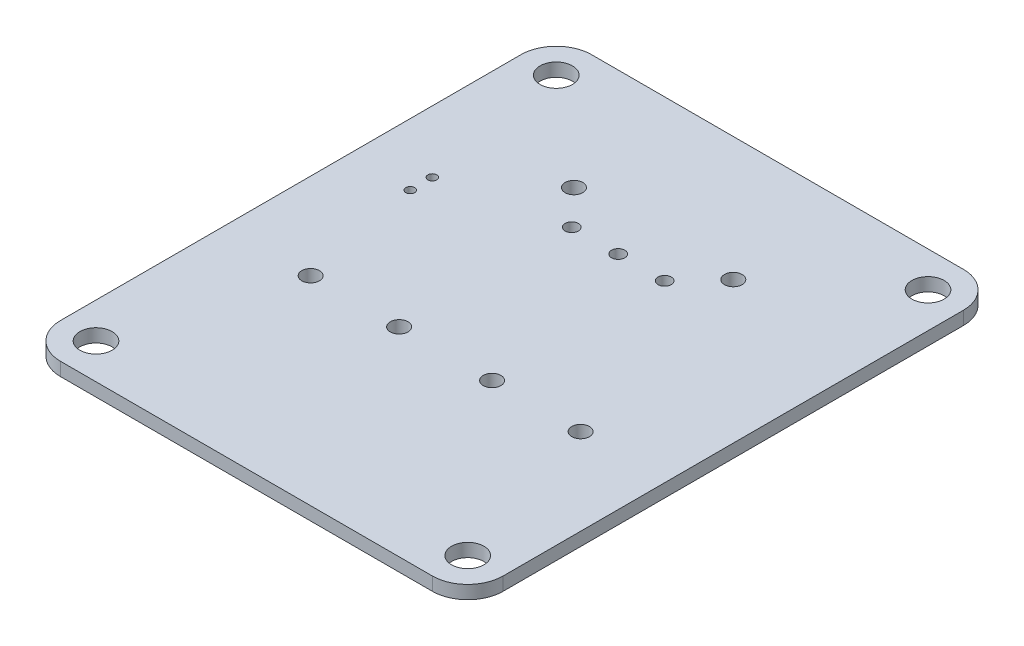
ISO-10303-21;
HEADER;
FILE_DESCRIPTION(('STEP AP214'),'2;1');
FILE_NAME('part.step','',(''),(''),'','','');
FILE_SCHEMA(('AUTOMOTIVE_DESIGN { 1 0 10303 214 1 1 1 1 }'));
ENDSEC;
DATA;
#1=APPLICATION_CONTEXT('core data for automotive mechanical design processes');
#2=APPLICATION_PROTOCOL_DEFINITION('international standard','automotive_design',2000,#1);
#3=PRODUCT_CONTEXT('',#1,'mechanical');
#4=PRODUCT('Part','Part','',(#3));
#5=PRODUCT_RELATED_PRODUCT_CATEGORY('part','',(#4));
#6=PRODUCT_DEFINITION_FORMATION('','',#4);
#7=PRODUCT_DEFINITION_CONTEXT('part definition',#1,'design');
#8=PRODUCT_DEFINITION('design','',#6,#7);
#9=PRODUCT_DEFINITION_SHAPE('','',#8);
#10=(LENGTH_UNIT() NAMED_UNIT(*) SI_UNIT(.MILLI.,.METRE.));
#11=(NAMED_UNIT(*) PLANE_ANGLE_UNIT() SI_UNIT($,.RADIAN.));
#12=(NAMED_UNIT(*) SI_UNIT($,.STERADIAN.) SOLID_ANGLE_UNIT());
#13=UNCERTAINTY_MEASURE_WITH_UNIT(LENGTH_MEASURE(1.E-05),#10,'distance_accuracy_value','');
#14=(GEOMETRIC_REPRESENTATION_CONTEXT(3) GLOBAL_UNCERTAINTY_ASSIGNED_CONTEXT((#13)) GLOBAL_UNIT_ASSIGNED_CONTEXT((#10,
#11,#12)) REPRESENTATION_CONTEXT('',''));
#15=CARTESIAN_POINT('',(0.,0.,0.));
#16=DIRECTION('',(0.,0.,1.));
#17=DIRECTION('',(1.,0.,0.));
#18=AXIS2_PLACEMENT_3D('',#15,#16,#17);
#19=CARTESIAN_POINT('',(-21.,1.5,26.));
#20=DIRECTION('',(0.,1.,0.));
#21=DIRECTION('',(0.,0.,1.));
#22=AXIS2_PLACEMENT_3D('',#19,#20,#21);
#23=PLANE('',#22);
#24=CARTESIAN_POINT('',(-18.,1.5,-6.49999999999999));
#25=DIRECTION('',(0.,1.,0.));
#26=DIRECTION('',(0.,0.,1.));
#27=AXIS2_PLACEMENT_3D('',#24,#25,#26);
#28=CIRCLE('',#27,0.499999999999999);
#29=CARTESIAN_POINT('',(-18.,1.5,-5.99999999999999));
#30=VERTEX_POINT('',#29);
#31=EDGE_CURVE('E282',#30,#30,#28,.T.);
#32=ORIENTED_EDGE('',*,*,#31,.F.);
#33=EDGE_LOOP('',(#32));
#34=FACE_BOUND('',#33,.T.);
#35=CARTESIAN_POINT('',(-18.,1.5,-8.99999999999999));
#36=DIRECTION('',(0.,1.,0.));
#37=DIRECTION('',(0.,0.,1.));
#38=AXIS2_PLACEMENT_3D('',#35,#36,#37);
#39=CIRCLE('',#38,0.499999999999999);
#40=CARTESIAN_POINT('',(-18.,1.5,-8.49999999999999));
#41=VERTEX_POINT('',#40);
#42=EDGE_CURVE('E276',#41,#41,#39,.T.);
#43=ORIENTED_EDGE('',*,*,#42,.F.);
#44=EDGE_LOOP('',(#43));
#45=FACE_BOUND('',#44,.T.);
#46=CARTESIAN_POINT('',(15.25,1.5,7.5));
#47=DIRECTION('',(0.,1.,0.));
#48=DIRECTION('',(0.,0.,-1.));
#49=AXIS2_PLACEMENT_3D('',#46,#47,#48);
#50=CIRCLE('',#49,1.);
#51=CARTESIAN_POINT('',(15.25,1.5,6.49999999999999));
#52=VERTEX_POINT('',#51);
#53=EDGE_CURVE('E270',#52,#52,#50,.T.);
#54=ORIENTED_EDGE('',*,*,#53,.F.);
#55=EDGE_LOOP('',(#54));
#56=FACE_BOUND('',#55,.T.);
#57=CARTESIAN_POINT('',(5.25,1.5,7.5));
#58=DIRECTION('',(0.,1.,0.));
#59=DIRECTION('',(0.,0.,-1.));
#60=AXIS2_PLACEMENT_3D('',#57,#58,#59);
#61=CIRCLE('',#60,1.);
#62=CARTESIAN_POINT('',(5.25,1.5,6.5));
#63=VERTEX_POINT('',#62);
#64=EDGE_CURVE('E264',#63,#63,#61,.T.);
#65=ORIENTED_EDGE('',*,*,#64,.F.);
#66=EDGE_LOOP('',(#65));
#67=FACE_BOUND('',#66,.T.);
#68=CARTESIAN_POINT('',(-5.25,1.5,7.5));
#69=DIRECTION('',(0.,1.,0.));
#70=DIRECTION('',(0.,0.,1.));
#71=AXIS2_PLACEMENT_3D('',#68,#69,#70);
#72=CIRCLE('',#71,1.);
#73=CARTESIAN_POINT('',(-5.25,1.5,8.5));
#74=VERTEX_POINT('',#73);
#75=EDGE_CURVE('E258',#74,#74,#72,.T.);
#76=ORIENTED_EDGE('',*,*,#75,.F.);
#77=EDGE_LOOP('',(#76));
#78=FACE_BOUND('',#77,.T.);
#79=CARTESIAN_POINT('',(-15.25,1.5,7.5));
#80=DIRECTION('',(0.,1.,0.));
#81=DIRECTION('',(0.,0.,1.));
#82=AXIS2_PLACEMENT_3D('',#79,#80,#81);
#83=CIRCLE('',#82,1.);
#84=CARTESIAN_POINT('',(-15.25,1.5,8.5));
#85=VERTEX_POINT('',#84);
#86=EDGE_CURVE('E252',#85,#85,#83,.T.);
#87=ORIENTED_EDGE('',*,*,#86,.F.);
#88=EDGE_LOOP('',(#87));
#89=FACE_BOUND('',#88,.T.);
#90=CARTESIAN_POINT('',(5.25,1.5,-12.));
#91=DIRECTION('',(0.,1.,0.));
#92=DIRECTION('',(0.,0.,-1.));
#93=AXIS2_PLACEMENT_3D('',#90,#91,#92);
#94=CIRCLE('',#93,0.75);
#95=CARTESIAN_POINT('',(5.25,1.5,-12.75));
#96=VERTEX_POINT('',#95);
#97=EDGE_CURVE('E246',#96,#96,#94,.T.);
#98=ORIENTED_EDGE('',*,*,#97,.F.);
#99=EDGE_LOOP('',(#98));
#100=FACE_BOUND('',#99,.T.);
#101=CARTESIAN_POINT('',(0.,1.5,-12.));
#102=DIRECTION('',(0.,1.,0.));
#103=DIRECTION('',(0.,0.,1.));
#104=AXIS2_PLACEMENT_3D('',#101,#102,#103);
#105=CIRCLE('',#104,0.75);
#106=CARTESIAN_POINT('',(0.,1.5,-11.25));
#107=VERTEX_POINT('',#106);
#108=EDGE_CURVE('E240',#107,#107,#105,.T.);
#109=ORIENTED_EDGE('',*,*,#108,.F.);
#110=EDGE_LOOP('',(#109));
#111=FACE_BOUND('',#110,.T.);
#112=CARTESIAN_POINT('',(-5.25,1.5,-12.));
#113=DIRECTION('',(0.,1.,0.));
#114=DIRECTION('',(0.,0.,1.));
#115=AXIS2_PLACEMENT_3D('',#112,#113,#114);
#116=CIRCLE('',#115,0.75);
#117=CARTESIAN_POINT('',(-5.25,1.5,-11.25));
#118=VERTEX_POINT('',#117);
#119=EDGE_CURVE('E234',#118,#118,#116,.T.);
#120=ORIENTED_EDGE('',*,*,#119,.F.);
#121=EDGE_LOOP('',(#120));
#122=FACE_BOUND('',#121,.T.);
#123=CARTESIAN_POINT('',(9.,1.5,-16.));
#124=DIRECTION('',(0.,1.,0.));
#125=DIRECTION('',(0.,0.,-1.));
#126=AXIS2_PLACEMENT_3D('',#123,#124,#125);
#127=CIRCLE('',#126,1.);
#128=CARTESIAN_POINT('',(9.,1.5,-17.));
#129=VERTEX_POINT('',#128);
#130=EDGE_CURVE('E228',#129,#129,#127,.T.);
#131=ORIENTED_EDGE('',*,*,#130,.F.);
#132=EDGE_LOOP('',(#131));
#133=FACE_BOUND('',#132,.T.);
#134=CARTESIAN_POINT('',(-9.,1.5,-16.));
#135=DIRECTION('',(0.,1.,0.));
#136=DIRECTION('',(0.,0.,1.));
#137=AXIS2_PLACEMENT_3D('',#134,#135,#136);
#138=CIRCLE('',#137,1.);
#139=CARTESIAN_POINT('',(-9.,1.5,-15.));
#140=VERTEX_POINT('',#139);
#141=EDGE_CURVE('E222',#140,#140,#138,.T.);
#142=ORIENTED_EDGE('',*,*,#141,.F.);
#143=EDGE_LOOP('',(#142));
#144=FACE_BOUND('',#143,.T.);
#145=CARTESIAN_POINT('',(21.,1.5,26.));
#146=DIRECTION('',(0.,1.,0.));
#147=DIRECTION('',(0.,0.,1.));
#148=AXIS2_PLACEMENT_3D('',#145,#146,#147);
#149=CIRCLE('',#148,1.825);
#150=CARTESIAN_POINT('',(21.,1.5,27.825));
#151=VERTEX_POINT('',#150);
#152=EDGE_CURVE('E203',#151,#151,#149,.T.);
#153=ORIENTED_EDGE('',*,*,#152,.F.);
#154=EDGE_LOOP('',(#153));
#155=FACE_BOUND('',#154,.T.);
#156=CARTESIAN_POINT('',(-21.,1.5,-26.));
#157=DIRECTION('',(0.,1.,0.));
#158=DIRECTION('',(0.,0.,1.));
#159=AXIS2_PLACEMENT_3D('',#156,#157,#158);
#160=CIRCLE('',#159,1.825);
#161=CARTESIAN_POINT('',(-21.,1.5,-24.175));
#162=VERTEX_POINT('',#161);
#163=EDGE_CURVE('E142',#162,#162,#160,.T.);
#164=ORIENTED_EDGE('',*,*,#163,.F.);
#165=EDGE_LOOP('',(#164));
#166=FACE_BOUND('',#165,.T.);
#167=CARTESIAN_POINT('',(-21.,1.5,26.));
#168=DIRECTION('',(0.,1.,0.));
#169=DIRECTION('',(0.,0.,1.));
#170=AXIS2_PLACEMENT_3D('',#167,#168,#169);
#171=CIRCLE('',#170,4.);
#172=CARTESIAN_POINT('',(-25.,1.5,26.));
#173=VERTEX_POINT('',#172);
#174=CARTESIAN_POINT('',(-21.,1.5,30.));
#175=VERTEX_POINT('',#174);
#176=EDGE_CURVE('E156',#173,#175,#171,.T.);
#177=ORIENTED_EDGE('',*,*,#176,.T.);
#178=DIRECTION('',(1.,0.,0.));
#179=VECTOR('',#178,1.);
#180=CARTESIAN_POINT('',(-21.,1.5,30.));
#181=LINE('',#180,#179);
#182=CARTESIAN_POINT('',(21.,1.5,30.));
#183=VERTEX_POINT('',#182);
#184=EDGE_CURVE('E100',#175,#183,#181,.T.);
#185=ORIENTED_EDGE('',*,*,#184,.T.);
#186=CARTESIAN_POINT('',(21.,1.5,26.));
#187=DIRECTION('',(0.,1.,0.));
#188=DIRECTION('',(0.,0.,1.));
#189=AXIS2_PLACEMENT_3D('',#186,#187,#188);
#190=CIRCLE('',#189,4.);
#191=CARTESIAN_POINT('',(25.,1.5,26.));
#192=VERTEX_POINT('',#191);
#193=EDGE_CURVE('E172',#183,#192,#190,.T.);
#194=ORIENTED_EDGE('',*,*,#193,.T.);
#195=DIRECTION('',(0.,0.,-1.));
#196=VECTOR('',#195,1.);
#197=CARTESIAN_POINT('',(25.,1.5,-26.));
#198=LINE('',#197,#196);
#199=CARTESIAN_POINT('',(25.,1.5,-26.));
#200=VERTEX_POINT('',#199);
#201=EDGE_CURVE('E185',#192,#200,#198,.T.);
#202=ORIENTED_EDGE('',*,*,#201,.T.);
#203=CARTESIAN_POINT('',(21.,1.5,-26.));
#204=DIRECTION('',(0.,1.,0.));
#205=DIRECTION('',(0.,0.,-1.));
#206=AXIS2_PLACEMENT_3D('',#203,#204,#205);
#207=CIRCLE('',#206,4.);
#208=CARTESIAN_POINT('',(21.,1.5,-30.));
#209=VERTEX_POINT('',#208);
#210=EDGE_CURVE('E120',#200,#209,#207,.T.);
#211=ORIENTED_EDGE('',*,*,#210,.T.);
#212=DIRECTION('',(-1.,0.,0.));
#213=VECTOR('',#212,1.);
#214=CARTESIAN_POINT('',(-21.,1.5,-30.));
#215=LINE('',#214,#213);
#216=CARTESIAN_POINT('',(-21.,1.5,-30.));
#217=VERTEX_POINT('',#216);
#218=EDGE_CURVE('E114',#209,#217,#215,.T.);
#219=ORIENTED_EDGE('',*,*,#218,.T.);
#220=CARTESIAN_POINT('',(-21.,1.5,-26.));
#221=DIRECTION('',(0.,1.,0.));
#222=DIRECTION('',(0.,0.,1.));
#223=AXIS2_PLACEMENT_3D('',#220,#221,#222);
#224=CIRCLE('',#223,4.);
#225=CARTESIAN_POINT('',(-25.,1.5,-26.));
#226=VERTEX_POINT('',#225);
#227=EDGE_CURVE('E118',#217,#226,#224,.T.);
#228=ORIENTED_EDGE('',*,*,#227,.T.);
#229=DIRECTION('',(0.,0.,1.));
#230=VECTOR('',#229,1.);
#231=CARTESIAN_POINT('',(-25.,1.5,-26.));
#232=LINE('',#231,#230);
#233=EDGE_CURVE('E56',#226,#173,#232,.T.);
#234=ORIENTED_EDGE('',*,*,#233,.T.);
#235=EDGE_LOOP('',(#177,#185,#194,#202,#211,#219,#228,#234));
#236=FACE_BOUND('',#235,.T.);
#237=CARTESIAN_POINT('',(21.,1.5,-26.));
#238=DIRECTION('',(0.,1.,0.));
#239=DIRECTION('',(0.,0.,-1.));
#240=AXIS2_PLACEMENT_3D('',#237,#238,#239);
#241=CIRCLE('',#240,1.825);
#242=CARTESIAN_POINT('',(21.,1.5,-27.825));
#243=VERTEX_POINT('',#242);
#244=EDGE_CURVE('E197',#243,#243,#241,.T.);
#245=ORIENTED_EDGE('',*,*,#244,.F.);
#246=EDGE_LOOP('',(#245));
#247=FACE_BOUND('',#246,.T.);
#248=CARTESIAN_POINT('',(-21.,1.5,26.));
#249=DIRECTION('',(0.,1.,0.));
#250=DIRECTION('',(0.,0.,-1.));
#251=AXIS2_PLACEMENT_3D('',#248,#249,#250);
#252=CIRCLE('',#251,1.825);
#253=CARTESIAN_POINT('',(-21.,1.5,24.175));
#254=VERTEX_POINT('',#253);
#255=EDGE_CURVE('E210',#254,#254,#252,.T.);
#256=ORIENTED_EDGE('',*,*,#255,.F.);
#257=EDGE_LOOP('',(#256));
#258=FACE_BOUND('',#257,.T.);
#259=ADVANCED_FACE('F39',(#34,#45,#56,#67,#78,#89,#100,#111,#122,#133,#144,#155,#166,#236,#247,
#258),#23,.T.);
#260=CARTESIAN_POINT('',(-21.,0.,26.));
#261=DIRECTION('',(0.,1.,0.));
#262=DIRECTION('',(0.,0.,1.));
#263=AXIS2_PLACEMENT_3D('',#260,#261,#262);
#264=PLANE('',#263);
#265=CARTESIAN_POINT('',(-18.,0.,-6.49999999999999));
#266=DIRECTION('',(0.,1.,0.));
#267=DIRECTION('',(0.,0.,1.));
#268=AXIS2_PLACEMENT_3D('',#265,#266,#267);
#269=CIRCLE('',#268,0.499999999999999);
#270=CARTESIAN_POINT('',(-18.,0.,-5.99999999999999));
#271=VERTEX_POINT('',#270);
#272=EDGE_CURVE('E279',#271,#271,#269,.F.);
#273=ORIENTED_EDGE('',*,*,#272,.F.);
#274=EDGE_LOOP('',(#273));
#275=FACE_BOUND('',#274,.T.);
#276=CARTESIAN_POINT('',(-18.,0.,-8.99999999999999));
#277=DIRECTION('',(0.,1.,0.));
#278=DIRECTION('',(0.,0.,1.));
#279=AXIS2_PLACEMENT_3D('',#276,#277,#278);
#280=CIRCLE('',#279,0.499999999999999);
#281=CARTESIAN_POINT('',(-18.,0.,-8.49999999999999));
#282=VERTEX_POINT('',#281);
#283=EDGE_CURVE('E273',#282,#282,#280,.F.);
#284=ORIENTED_EDGE('',*,*,#283,.F.);
#285=EDGE_LOOP('',(#284));
#286=FACE_BOUND('',#285,.T.);
#287=CARTESIAN_POINT('',(15.25,0.,7.5));
#288=DIRECTION('',(0.,1.,0.));
#289=DIRECTION('',(0.,0.,1.));
#290=AXIS2_PLACEMENT_3D('',#287,#288,#289);
#291=CIRCLE('',#290,1.);
#292=CARTESIAN_POINT('',(15.25,0.,8.5));
#293=VERTEX_POINT('',#292);
#294=EDGE_CURVE('E267',#293,#293,#291,.F.);
#295=ORIENTED_EDGE('',*,*,#294,.F.);
#296=EDGE_LOOP('',(#295));
#297=FACE_BOUND('',#296,.T.);
#298=CARTESIAN_POINT('',(5.25,0.,7.5));
#299=DIRECTION('',(0.,1.,0.));
#300=DIRECTION('',(0.,0.,1.));
#301=AXIS2_PLACEMENT_3D('',#298,#299,#300);
#302=CIRCLE('',#301,1.);
#303=CARTESIAN_POINT('',(5.25,0.,8.5));
#304=VERTEX_POINT('',#303);
#305=EDGE_CURVE('E261',#304,#304,#302,.F.);
#306=ORIENTED_EDGE('',*,*,#305,.F.);
#307=EDGE_LOOP('',(#306));
#308=FACE_BOUND('',#307,.T.);
#309=CARTESIAN_POINT('',(-5.25,0.,7.5));
#310=DIRECTION('',(0.,1.,0.));
#311=DIRECTION('',(0.,0.,1.));
#312=AXIS2_PLACEMENT_3D('',#309,#310,#311);
#313=CIRCLE('',#312,1.);
#314=CARTESIAN_POINT('',(-5.25,0.,8.5));
#315=VERTEX_POINT('',#314);
#316=EDGE_CURVE('E255',#315,#315,#313,.F.);
#317=ORIENTED_EDGE('',*,*,#316,.F.);
#318=EDGE_LOOP('',(#317));
#319=FACE_BOUND('',#318,.T.);
#320=CARTESIAN_POINT('',(-15.25,0.,7.5));
#321=DIRECTION('',(0.,1.,0.));
#322=DIRECTION('',(0.,0.,1.));
#323=AXIS2_PLACEMENT_3D('',#320,#321,#322);
#324=CIRCLE('',#323,1.);
#325=CARTESIAN_POINT('',(-15.25,0.,8.5));
#326=VERTEX_POINT('',#325);
#327=EDGE_CURVE('E249',#326,#326,#324,.F.);
#328=ORIENTED_EDGE('',*,*,#327,.F.);
#329=EDGE_LOOP('',(#328));
#330=FACE_BOUND('',#329,.T.);
#331=CARTESIAN_POINT('',(5.25,0.,-12.));
#332=DIRECTION('',(0.,1.,0.));
#333=DIRECTION('',(0.,0.,1.));
#334=AXIS2_PLACEMENT_3D('',#331,#332,#333);
#335=CIRCLE('',#334,0.75);
#336=CARTESIAN_POINT('',(5.25,0.,-11.25));
#337=VERTEX_POINT('',#336);
#338=EDGE_CURVE('E243',#337,#337,#335,.F.);
#339=ORIENTED_EDGE('',*,*,#338,.F.);
#340=EDGE_LOOP('',(#339));
#341=FACE_BOUND('',#340,.T.);
#342=CARTESIAN_POINT('',(0.,0.,-12.));
#343=DIRECTION('',(0.,1.,0.));
#344=DIRECTION('',(0.,0.,1.));
#345=AXIS2_PLACEMENT_3D('',#342,#343,#344);
#346=CIRCLE('',#345,0.75);
#347=CARTESIAN_POINT('',(0.,0.,-11.25));
#348=VERTEX_POINT('',#347);
#349=EDGE_CURVE('E237',#348,#348,#346,.F.);
#350=ORIENTED_EDGE('',*,*,#349,.F.);
#351=EDGE_LOOP('',(#350));
#352=FACE_BOUND('',#351,.T.);
#353=CARTESIAN_POINT('',(-5.25,0.,-12.));
#354=DIRECTION('',(0.,1.,0.));
#355=DIRECTION('',(0.,0.,1.));
#356=AXIS2_PLACEMENT_3D('',#353,#354,#355);
#357=CIRCLE('',#356,0.75);
#358=CARTESIAN_POINT('',(-5.25,0.,-11.25));
#359=VERTEX_POINT('',#358);
#360=EDGE_CURVE('E231',#359,#359,#357,.F.);
#361=ORIENTED_EDGE('',*,*,#360,.F.);
#362=EDGE_LOOP('',(#361));
#363=FACE_BOUND('',#362,.T.);
#364=CARTESIAN_POINT('',(9.,0.,-16.));
#365=DIRECTION('',(0.,1.,0.));
#366=DIRECTION('',(0.,0.,1.));
#367=AXIS2_PLACEMENT_3D('',#364,#365,#366);
#368=CIRCLE('',#367,1.);
#369=CARTESIAN_POINT('',(9.,0.,-15.));
#370=VERTEX_POINT('',#369);
#371=EDGE_CURVE('E225',#370,#370,#368,.F.);
#372=ORIENTED_EDGE('',*,*,#371,.F.);
#373=EDGE_LOOP('',(#372));
#374=FACE_BOUND('',#373,.T.);
#375=CARTESIAN_POINT('',(-9.,0.,-16.));
#376=DIRECTION('',(0.,1.,0.));
#377=DIRECTION('',(0.,0.,1.));
#378=AXIS2_PLACEMENT_3D('',#375,#376,#377);
#379=CIRCLE('',#378,1.);
#380=CARTESIAN_POINT('',(-9.,0.,-15.));
#381=VERTEX_POINT('',#380);
#382=EDGE_CURVE('E217',#381,#381,#379,.F.);
#383=ORIENTED_EDGE('',*,*,#382,.F.);
#384=EDGE_LOOP('',(#383));
#385=FACE_BOUND('',#384,.T.);
#386=CARTESIAN_POINT('',(-21.,0.,26.));
#387=DIRECTION('',(0.,1.,0.));
#388=DIRECTION('',(0.,0.,1.));
#389=AXIS2_PLACEMENT_3D('',#386,#387,#388);
#390=CIRCLE('',#389,4.);
#391=CARTESIAN_POINT('',(-25.,0.,26.));
#392=VERTEX_POINT('',#391);
#393=CARTESIAN_POINT('',(-21.,0.,30.));
#394=VERTEX_POINT('',#393);
#395=EDGE_CURVE('E138',#392,#394,#390,.T.);
#396=ORIENTED_EDGE('',*,*,#395,.F.);
#397=DIRECTION('',(0.,0.,1.));
#398=VECTOR('',#397,1.);
#399=CARTESIAN_POINT('',(-25.,0.,-26.));
#400=LINE('',#399,#398);
#401=CARTESIAN_POINT('',(-25.,0.,-26.));
#402=VERTEX_POINT('',#401);
#403=EDGE_CURVE('E92',#402,#392,#400,.T.);
#404=ORIENTED_EDGE('',*,*,#403,.F.);
#405=CARTESIAN_POINT('',(-21.,0.,-26.));
#406=DIRECTION('',(0.,1.,0.));
#407=DIRECTION('',(0.,0.,1.));
#408=AXIS2_PLACEMENT_3D('',#405,#406,#407);
#409=CIRCLE('',#408,4.);
#410=CARTESIAN_POINT('',(-21.,0.,-30.));
#411=VERTEX_POINT('',#410);
#412=EDGE_CURVE('E86',#411,#402,#409,.T.);
#413=ORIENTED_EDGE('',*,*,#412,.F.);
#414=DIRECTION('',(-1.,0.,0.));
#415=VECTOR('',#414,1.);
#416=CARTESIAN_POINT('',(-21.,0.,-30.));
#417=LINE('',#416,#415);
#418=CARTESIAN_POINT('',(21.,0.,-30.));
#419=VERTEX_POINT('',#418);
#420=EDGE_CURVE('E128',#419,#411,#417,.T.);
#421=ORIENTED_EDGE('',*,*,#420,.F.);
#422=CARTESIAN_POINT('',(21.,0.,-26.));
#423=DIRECTION('',(0.,1.,0.));
#424=DIRECTION('',(0.,0.,-1.));
#425=AXIS2_PLACEMENT_3D('',#422,#423,#424);
#426=CIRCLE('',#425,4.);
#427=CARTESIAN_POINT('',(25.,0.,-26.));
#428=VERTEX_POINT('',#427);
#429=EDGE_CURVE('E151',#428,#419,#426,.T.);
#430=ORIENTED_EDGE('',*,*,#429,.F.);
#431=DIRECTION('',(0.,0.,-1.));
#432=VECTOR('',#431,1.);
#433=CARTESIAN_POINT('',(25.,0.,-26.));
#434=LINE('',#433,#432);
#435=CARTESIAN_POINT('',(25.,0.,26.));
#436=VERTEX_POINT('',#435);
#437=EDGE_CURVE('E148',#436,#428,#434,.T.);
#438=ORIENTED_EDGE('',*,*,#437,.F.);
#439=CARTESIAN_POINT('',(21.,0.,26.));
#440=DIRECTION('',(0.,1.,0.));
#441=DIRECTION('',(0.,0.,1.));
#442=AXIS2_PLACEMENT_3D('',#439,#440,#441);
#443=CIRCLE('',#442,4.);
#444=CARTESIAN_POINT('',(21.,0.,30.));
#445=VERTEX_POINT('',#444);
#446=EDGE_CURVE('E145',#445,#436,#443,.T.);
#447=ORIENTED_EDGE('',*,*,#446,.F.);
#448=DIRECTION('',(1.,0.,0.));
#449=VECTOR('',#448,1.);
#450=CARTESIAN_POINT('',(-21.,0.,30.));
#451=LINE('',#450,#449);
#452=EDGE_CURVE('E141',#394,#445,#451,.T.);
#453=ORIENTED_EDGE('',*,*,#452,.F.);
#454=EDGE_LOOP('',(#396,#404,#413,#421,#430,#438,#447,#453));
#455=FACE_BOUND('',#454,.T.);
#456=CARTESIAN_POINT('',(-21.,0.,-26.));
#457=DIRECTION('',(0.,1.,0.));
#458=DIRECTION('',(0.,0.,1.));
#459=AXIS2_PLACEMENT_3D('',#456,#457,#458);
#460=CIRCLE('',#459,1.825);
#461=CARTESIAN_POINT('',(-21.,0.,-24.175));
#462=VERTEX_POINT('',#461);
#463=EDGE_CURVE('E194',#462,#462,#460,.T.);
#464=ORIENTED_EDGE('',*,*,#463,.T.);
#465=EDGE_LOOP('',(#464));
#466=FACE_BOUND('',#465,.T.);
#467=CARTESIAN_POINT('',(21.,0.,-26.));
#468=DIRECTION('',(0.,1.,0.));
#469=DIRECTION('',(0.,0.,-1.));
#470=AXIS2_PLACEMENT_3D('',#467,#468,#469);
#471=CIRCLE('',#470,1.825);
#472=CARTESIAN_POINT('',(21.,0.,-27.825));
#473=VERTEX_POINT('',#472);
#474=EDGE_CURVE('E200',#473,#473,#471,.T.);
#475=ORIENTED_EDGE('',*,*,#474,.T.);
#476=EDGE_LOOP('',(#475));
#477=FACE_BOUND('',#476,.T.);
#478=CARTESIAN_POINT('',(21.,0.,26.));
#479=DIRECTION('',(0.,1.,0.));
#480=DIRECTION('',(0.,0.,1.));
#481=AXIS2_PLACEMENT_3D('',#478,#479,#480);
#482=CIRCLE('',#481,1.825);
#483=CARTESIAN_POINT('',(21.,0.,27.825));
#484=VERTEX_POINT('',#483);
#485=EDGE_CURVE('E206',#484,#484,#482,.T.);
#486=ORIENTED_EDGE('',*,*,#485,.T.);
#487=EDGE_LOOP('',(#486));
#488=FACE_BOUND('',#487,.T.);
#489=CARTESIAN_POINT('',(-21.,0.,26.));
#490=DIRECTION('',(0.,1.,0.));
#491=DIRECTION('',(0.,0.,-1.));
#492=AXIS2_PLACEMENT_3D('',#489,#490,#491);
#493=CIRCLE('',#492,1.825);
#494=CARTESIAN_POINT('',(-21.,0.,24.175));
#495=VERTEX_POINT('',#494);
#496=EDGE_CURVE('E214',#495,#495,#493,.T.);
#497=ORIENTED_EDGE('',*,*,#496,.T.);
#498=EDGE_LOOP('',(#497));
#499=FACE_BOUND('',#498,.T.);
#500=ADVANCED_FACE('F176',(#275,#286,#297,#308,#319,#330,#341,#352,#363,#374,#385,#455,#466,
#477,#488,#499),#264,.F.);
#501=CARTESIAN_POINT('',(-21.,1.5,26.));
#502=DIRECTION('',(0.,-1.,0.));
#503=DIRECTION('',(0.,0.,-1.));
#504=AXIS2_PLACEMENT_3D('',#501,#502,#503);
#505=CYLINDRICAL_SURFACE('',#504,4.);
#506=ORIENTED_EDGE('',*,*,#395,.T.);
#507=DIRECTION('',(0.,-1.,0.));
#508=VECTOR('',#507,1.);
#509=CARTESIAN_POINT('',(-21.,1.5,30.));
#510=LINE('',#509,#508);
#511=EDGE_CURVE('E11',#175,#394,#510,.T.);
#512=ORIENTED_EDGE('',*,*,#511,.F.);
#513=ORIENTED_EDGE('',*,*,#176,.F.);
#514=DIRECTION('',(0.,-1.,0.));
#515=VECTOR('',#514,1.);
#516=CARTESIAN_POINT('',(-25.,1.5,26.));
#517=LINE('',#516,#515);
#518=EDGE_CURVE('E134',#173,#392,#517,.T.);
#519=ORIENTED_EDGE('',*,*,#518,.T.);
#520=EDGE_LOOP('',(#506,#512,#513,#519));
#521=FACE_BOUND('',#520,.T.);
#522=ADVANCED_FACE('F41',(#521),#505,.T.);
#523=CARTESIAN_POINT('',(-21.,1.5,30.));
#524=DIRECTION('',(0.,0.,-1.));
#525=DIRECTION('',(-1.,0.,0.));
#526=AXIS2_PLACEMENT_3D('',#523,#524,#525);
#527=PLANE('',#526);
#528=ORIENTED_EDGE('',*,*,#452,.T.);
#529=DIRECTION('',(0.,-1.,0.));
#530=VECTOR('',#529,1.);
#531=CARTESIAN_POINT('',(21.,1.5,30.));
#532=LINE('',#531,#530);
#533=EDGE_CURVE('E48',#183,#445,#532,.T.);
#534=ORIENTED_EDGE('',*,*,#533,.F.);
#535=ORIENTED_EDGE('',*,*,#184,.F.);
#536=ORIENTED_EDGE('',*,*,#511,.T.);
#537=EDGE_LOOP('',(#528,#534,#535,#536));
#538=FACE_BOUND('',#537,.T.);
#539=ADVANCED_FACE('F364',(#538),#527,.F.);
#540=CARTESIAN_POINT('',(21.,1.5,26.));
#541=DIRECTION('',(0.,-1.,0.));
#542=DIRECTION('',(0.,0.,-1.));
#543=AXIS2_PLACEMENT_3D('',#540,#541,#542);
#544=CYLINDRICAL_SURFACE('',#543,4.);
#545=ORIENTED_EDGE('',*,*,#446,.T.);
#546=DIRECTION('',(0.,-1.,0.));
#547=VECTOR('',#546,1.);
#548=CARTESIAN_POINT('',(25.,1.5,26.));
#549=LINE('',#548,#547);
#550=EDGE_CURVE('E163',#192,#436,#549,.T.);
#551=ORIENTED_EDGE('',*,*,#550,.F.);
#552=ORIENTED_EDGE('',*,*,#193,.F.);
#553=ORIENTED_EDGE('',*,*,#533,.T.);
#554=EDGE_LOOP('',(#545,#551,#552,#553));
#555=FACE_BOUND('',#554,.T.);
#556=ADVANCED_FACE('F170',(#555),#544,.T.);
#557=CARTESIAN_POINT('',(25.,1.5,-26.));
#558=DIRECTION('',(-1.,0.,0.));
#559=DIRECTION('',(0.,0.,1.));
#560=AXIS2_PLACEMENT_3D('',#557,#558,#559);
#561=PLANE('',#560);
#562=ORIENTED_EDGE('',*,*,#437,.T.);
#563=DIRECTION('',(0.,-1.,0.));
#564=VECTOR('',#563,1.);
#565=CARTESIAN_POINT('',(25.,1.5,-26.));
#566=LINE('',#565,#564);
#567=EDGE_CURVE('E160',#200,#428,#566,.T.);
#568=ORIENTED_EDGE('',*,*,#567,.F.);
#569=ORIENTED_EDGE('',*,*,#201,.F.);
#570=ORIENTED_EDGE('',*,*,#550,.T.);
#571=EDGE_LOOP('',(#562,#568,#569,#570));
#572=FACE_BOUND('',#571,.T.);
#573=ADVANCED_FACE('F181',(#572),#561,.F.);
#574=CARTESIAN_POINT('',(21.,1.5,-26.));
#575=DIRECTION('',(0.,-1.,0.));
#576=DIRECTION('',(0.,0.,-1.));
#577=AXIS2_PLACEMENT_3D('',#574,#575,#576);
#578=CYLINDRICAL_SURFACE('',#577,4.);
#579=ORIENTED_EDGE('',*,*,#429,.T.);
#580=DIRECTION('',(0.,-1.,0.));
#581=VECTOR('',#580,1.);
#582=CARTESIAN_POINT('',(21.,1.5,-30.));
#583=LINE('',#582,#581);
#584=EDGE_CURVE('E129',#209,#419,#583,.T.);
#585=ORIENTED_EDGE('',*,*,#584,.F.);
#586=ORIENTED_EDGE('',*,*,#210,.F.);
#587=ORIENTED_EDGE('',*,*,#567,.T.);
#588=EDGE_LOOP('',(#579,#585,#586,#587));
#589=FACE_BOUND('',#588,.T.);
#590=ADVANCED_FACE('F184',(#589),#578,.T.);
#591=CARTESIAN_POINT('',(-21.,1.5,-30.));
#592=DIRECTION('',(0.,0.,1.));
#593=DIRECTION('',(1.,0.,0.));
#594=AXIS2_PLACEMENT_3D('',#591,#592,#593);
#595=PLANE('',#594);
#596=ORIENTED_EDGE('',*,*,#420,.T.);
#597=DIRECTION('',(0.,-1.,0.));
#598=VECTOR('',#597,1.);
#599=CARTESIAN_POINT('',(-21.,1.5,-30.));
#600=LINE('',#599,#598);
#601=EDGE_CURVE('E125',#217,#411,#600,.T.);
#602=ORIENTED_EDGE('',*,*,#601,.F.);
#603=ORIENTED_EDGE('',*,*,#218,.F.);
#604=ORIENTED_EDGE('',*,*,#584,.T.);
#605=EDGE_LOOP('',(#596,#602,#603,#604));
#606=FACE_BOUND('',#605,.T.);
#607=ADVANCED_FACE('F126',(#606),#595,.F.);
#608=CARTESIAN_POINT('',(-21.,1.5,-26.));
#609=DIRECTION('',(0.,-1.,0.));
#610=DIRECTION('',(0.,0.,-1.));
#611=AXIS2_PLACEMENT_3D('',#608,#609,#610);
#612=CYLINDRICAL_SURFACE('',#611,4.);
#613=ORIENTED_EDGE('',*,*,#412,.T.);
#614=DIRECTION('',(0.,-1.,0.));
#615=VECTOR('',#614,1.);
#616=CARTESIAN_POINT('',(-25.,1.5,-26.));
#617=LINE('',#616,#615);
#618=EDGE_CURVE('E130',#226,#402,#617,.T.);
#619=ORIENTED_EDGE('',*,*,#618,.F.);
#620=ORIENTED_EDGE('',*,*,#227,.F.);
#621=ORIENTED_EDGE('',*,*,#601,.T.);
#622=EDGE_LOOP('',(#613,#619,#620,#621));
#623=FACE_BOUND('',#622,.T.);
#624=ADVANCED_FACE('F132',(#623),#612,.T.);
#625=CARTESIAN_POINT('',(-25.,1.5,-26.));
#626=DIRECTION('',(1.,0.,0.));
#627=DIRECTION('',(0.,0.,-1.));
#628=AXIS2_PLACEMENT_3D('',#625,#626,#627);
#629=PLANE('',#628);
#630=ORIENTED_EDGE('',*,*,#403,.T.);
#631=ORIENTED_EDGE('',*,*,#518,.F.);
#632=ORIENTED_EDGE('',*,*,#233,.F.);
#633=ORIENTED_EDGE('',*,*,#618,.T.);
#634=EDGE_LOOP('',(#630,#631,#632,#633));
#635=FACE_BOUND('',#634,.T.);
#636=ADVANCED_FACE('F320',(#635),#629,.F.);
#637=CARTESIAN_POINT('',(-21.,1.5,-26.));
#638=DIRECTION('',(0.,-1.,0.));
#639=DIRECTION('',(0.,0.,-1.));
#640=AXIS2_PLACEMENT_3D('',#637,#638,#639);
#641=CYLINDRICAL_SURFACE('',#640,1.825);
#642=ORIENTED_EDGE('',*,*,#163,.T.);
#643=EDGE_LOOP('',(#642));
#644=FACE_BOUND('',#643,.T.);
#645=ORIENTED_EDGE('',*,*,#463,.F.);
#646=EDGE_LOOP('',(#645));
#647=FACE_BOUND('',#646,.T.);
#648=ADVANCED_FACE('F316',(#644,#647),#641,.F.);
#649=CARTESIAN_POINT('',(21.,1.5,-26.));
#650=DIRECTION('',(0.,-1.,0.));
#651=DIRECTION('',(0.,0.,-1.));
#652=AXIS2_PLACEMENT_3D('',#649,#650,#651);
#653=CYLINDRICAL_SURFACE('',#652,1.825);
#654=ORIENTED_EDGE('',*,*,#244,.T.);
#655=EDGE_LOOP('',(#654));
#656=FACE_BOUND('',#655,.T.);
#657=ORIENTED_EDGE('',*,*,#474,.F.);
#658=EDGE_LOOP('',(#657));
#659=FACE_BOUND('',#658,.T.);
#660=ADVANCED_FACE('F319',(#656,#659),#653,.F.);
#661=CARTESIAN_POINT('',(21.,1.5,26.));
#662=DIRECTION('',(0.,-1.,0.));
#663=DIRECTION('',(0.,0.,-1.));
#664=AXIS2_PLACEMENT_3D('',#661,#662,#663);
#665=CYLINDRICAL_SURFACE('',#664,1.825);
#666=ORIENTED_EDGE('',*,*,#152,.T.);
#667=EDGE_LOOP('',(#666));
#668=FACE_BOUND('',#667,.T.);
#669=ORIENTED_EDGE('',*,*,#485,.F.);
#670=EDGE_LOOP('',(#669));
#671=FACE_BOUND('',#670,.T.);
#672=ADVANCED_FACE('F336',(#668,#671),#665,.F.);
#673=CARTESIAN_POINT('',(-21.,1.5,26.));
#674=DIRECTION('',(0.,-1.,0.));
#675=DIRECTION('',(0.,0.,-1.));
#676=AXIS2_PLACEMENT_3D('',#673,#674,#675);
#677=CYLINDRICAL_SURFACE('',#676,1.825);
#678=ORIENTED_EDGE('',*,*,#255,.T.);
#679=EDGE_LOOP('',(#678));
#680=FACE_BOUND('',#679,.T.);
#681=ORIENTED_EDGE('',*,*,#496,.F.);
#682=EDGE_LOOP('',(#681));
#683=FACE_BOUND('',#682,.T.);
#684=ADVANCED_FACE('F333',(#680,#683),#677,.F.);
#685=CARTESIAN_POINT('',(-9.,-0.000999999999999916,-16.));
#686=DIRECTION('',(0.,1.,0.));
#687=DIRECTION('',(0.,0.,1.));
#688=AXIS2_PLACEMENT_3D('',#685,#686,#687);
#689=CYLINDRICAL_SURFACE('',#688,1.);
#690=ORIENTED_EDGE('',*,*,#141,.T.);
#691=EDGE_LOOP('',(#690));
#692=FACE_BOUND('',#691,.T.);
#693=ORIENTED_EDGE('',*,*,#382,.T.);
#694=EDGE_LOOP('',(#693));
#695=FACE_BOUND('',#694,.T.);
#696=ADVANCED_FACE('F335',(#692,#695),#689,.F.);
#697=CARTESIAN_POINT('',(9.,-0.000999999999999916,-16.));
#698=DIRECTION('',(0.,1.,0.));
#699=DIRECTION('',(0.,0.,1.));
#700=AXIS2_PLACEMENT_3D('',#697,#698,#699);
#701=CYLINDRICAL_SURFACE('',#700,1.);
#702=ORIENTED_EDGE('',*,*,#130,.T.);
#703=EDGE_LOOP('',(#702));
#704=FACE_BOUND('',#703,.T.);
#705=ORIENTED_EDGE('',*,*,#371,.T.);
#706=EDGE_LOOP('',(#705));
#707=FACE_BOUND('',#706,.T.);
#708=ADVANCED_FACE('F343',(#704,#707),#701,.F.);
#709=CARTESIAN_POINT('',(-5.25,-0.000999999999999916,-12.));
#710=DIRECTION('',(0.,1.,0.));
#711=DIRECTION('',(0.,0.,1.));
#712=AXIS2_PLACEMENT_3D('',#709,#710,#711);
#713=CYLINDRICAL_SURFACE('',#712,0.75);
#714=ORIENTED_EDGE('',*,*,#119,.T.);
#715=EDGE_LOOP('',(#714));
#716=FACE_BOUND('',#715,.T.);
#717=ORIENTED_EDGE('',*,*,#360,.T.);
#718=EDGE_LOOP('',(#717));
#719=FACE_BOUND('',#718,.T.);
#720=ADVANCED_FACE('F440',(#716,#719),#713,.F.);
#721=CARTESIAN_POINT('',(0.,-0.000999999999999916,-12.));
#722=DIRECTION('',(0.,1.,0.));
#723=DIRECTION('',(0.,0.,1.));
#724=AXIS2_PLACEMENT_3D('',#721,#722,#723);
#725=CYLINDRICAL_SURFACE('',#724,0.75);
#726=ORIENTED_EDGE('',*,*,#108,.T.);
#727=EDGE_LOOP('',(#726));
#728=FACE_BOUND('',#727,.T.);
#729=ORIENTED_EDGE('',*,*,#349,.T.);
#730=EDGE_LOOP('',(#729));
#731=FACE_BOUND('',#730,.T.);
#732=ADVANCED_FACE('F448',(#728,#731),#725,.F.);
#733=CARTESIAN_POINT('',(5.25,-0.000999999999999916,-12.));
#734=DIRECTION('',(0.,1.,0.));
#735=DIRECTION('',(0.,0.,1.));
#736=AXIS2_PLACEMENT_3D('',#733,#734,#735);
#737=CYLINDRICAL_SURFACE('',#736,0.75);
#738=ORIENTED_EDGE('',*,*,#97,.T.);
#739=EDGE_LOOP('',(#738));
#740=FACE_BOUND('',#739,.T.);
#741=ORIENTED_EDGE('',*,*,#338,.T.);
#742=EDGE_LOOP('',(#741));
#743=FACE_BOUND('',#742,.T.);
#744=ADVANCED_FACE('F457',(#740,#743),#737,.F.);
#745=CARTESIAN_POINT('',(-15.25,-0.000999999999999916,7.5));
#746=DIRECTION('',(0.,1.,0.));
#747=DIRECTION('',(0.,0.,1.));
#748=AXIS2_PLACEMENT_3D('',#745,#746,#747);
#749=CYLINDRICAL_SURFACE('',#748,1.);
#750=ORIENTED_EDGE('',*,*,#86,.T.);
#751=EDGE_LOOP('',(#750));
#752=FACE_BOUND('',#751,.T.);
#753=ORIENTED_EDGE('',*,*,#327,.T.);
#754=EDGE_LOOP('',(#753));
#755=FACE_BOUND('',#754,.T.);
#756=ADVANCED_FACE('F466',(#752,#755),#749,.F.);
#757=CARTESIAN_POINT('',(-5.25,-0.000999999999999916,7.5));
#758=DIRECTION('',(0.,1.,0.));
#759=DIRECTION('',(0.,0.,1.));
#760=AXIS2_PLACEMENT_3D('',#757,#758,#759);
#761=CYLINDRICAL_SURFACE('',#760,1.);
#762=ORIENTED_EDGE('',*,*,#75,.T.);
#763=EDGE_LOOP('',(#762));
#764=FACE_BOUND('',#763,.T.);
#765=ORIENTED_EDGE('',*,*,#316,.T.);
#766=EDGE_LOOP('',(#765));
#767=FACE_BOUND('',#766,.T.);
#768=ADVANCED_FACE('F475',(#764,#767),#761,.F.);
#769=CARTESIAN_POINT('',(5.25,-0.000999999999999916,7.5));
#770=DIRECTION('',(0.,1.,0.));
#771=DIRECTION('',(0.,0.,1.));
#772=AXIS2_PLACEMENT_3D('',#769,#770,#771);
#773=CYLINDRICAL_SURFACE('',#772,1.);
#774=ORIENTED_EDGE('',*,*,#64,.T.);
#775=EDGE_LOOP('',(#774));
#776=FACE_BOUND('',#775,.T.);
#777=ORIENTED_EDGE('',*,*,#305,.T.);
#778=EDGE_LOOP('',(#777));
#779=FACE_BOUND('',#778,.T.);
#780=ADVANCED_FACE('F484',(#776,#779),#773,.F.);
#781=CARTESIAN_POINT('',(15.25,-0.000999999999999916,7.5));
#782=DIRECTION('',(0.,1.,0.));
#783=DIRECTION('',(0.,0.,1.));
#784=AXIS2_PLACEMENT_3D('',#781,#782,#783);
#785=CYLINDRICAL_SURFACE('',#784,1.);
#786=ORIENTED_EDGE('',*,*,#53,.T.);
#787=EDGE_LOOP('',(#786));
#788=FACE_BOUND('',#787,.T.);
#789=ORIENTED_EDGE('',*,*,#294,.T.);
#790=EDGE_LOOP('',(#789));
#791=FACE_BOUND('',#790,.T.);
#792=ADVANCED_FACE('F493',(#788,#791),#785,.F.);
#793=CARTESIAN_POINT('',(-18.,-0.000999999999999916,-8.99999999999999));
#794=DIRECTION('',(0.,1.,0.));
#795=DIRECTION('',(0.,0.,1.));
#796=AXIS2_PLACEMENT_3D('',#793,#794,#795);
#797=CYLINDRICAL_SURFACE('',#796,0.499999999999999);
#798=ORIENTED_EDGE('',*,*,#42,.T.);
#799=EDGE_LOOP('',(#798));
#800=FACE_BOUND('',#799,.T.);
#801=ORIENTED_EDGE('',*,*,#283,.T.);
#802=EDGE_LOOP('',(#801));
#803=FACE_BOUND('',#802,.T.);
#804=ADVANCED_FACE('F502',(#800,#803),#797,.F.);
#805=CARTESIAN_POINT('',(-18.,-0.000999999999999916,-6.49999999999999));
#806=DIRECTION('',(0.,1.,0.));
#807=DIRECTION('',(0.,0.,1.));
#808=AXIS2_PLACEMENT_3D('',#805,#806,#807);
#809=CYLINDRICAL_SURFACE('',#808,0.499999999999999);
#810=ORIENTED_EDGE('',*,*,#31,.T.);
#811=EDGE_LOOP('',(#810));
#812=FACE_BOUND('',#811,.T.);
#813=ORIENTED_EDGE('',*,*,#272,.T.);
#814=EDGE_LOOP('',(#813));
#815=FACE_BOUND('',#814,.T.);
#816=ADVANCED_FACE('F286',(#812,#815),#809,.F.);
#817=CLOSED_SHELL('',(#259,#500,#522,#539,#556,#573,#590,#607,#624,#636,#648,#660,#672,#684,
#696,#708,#720,#732,#744,#756,#768,#780,#792,#804,#816));
#818=MANIFOLD_SOLID_BREP('B2',#817);
#819=ADVANCED_BREP_SHAPE_REPRESENTATION('',(#18,#818),#14);
#820=SHAPE_DEFINITION_REPRESENTATION(#9,#819);
ENDSEC;
END-ISO-10303-21;
